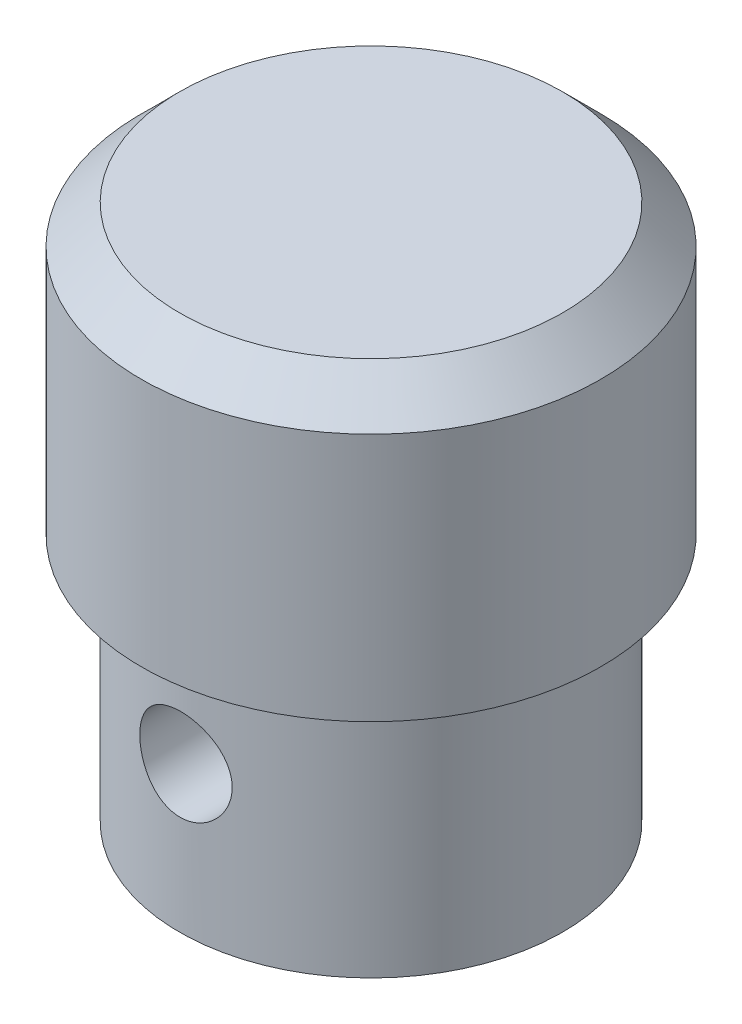
ISO-10303-21;
HEADER;
FILE_DESCRIPTION(('STEP AP214'),'2;1');
FILE_NAME('part.step','',(''),(''),'','','');
FILE_SCHEMA(('AUTOMOTIVE_DESIGN { 1 0 10303 214 1 1 1 1 }'));
ENDSEC;
DATA;
#1=APPLICATION_CONTEXT('core data for automotive mechanical design processes');
#2=APPLICATION_PROTOCOL_DEFINITION('international standard','automotive_design',2000,#1);
#3=PRODUCT_CONTEXT('',#1,'mechanical');
#4=PRODUCT('Part','Part','',(#3));
#5=PRODUCT_RELATED_PRODUCT_CATEGORY('part','',(#4));
#6=PRODUCT_DEFINITION_FORMATION('','',#4);
#7=PRODUCT_DEFINITION_CONTEXT('part definition',#1,'design');
#8=PRODUCT_DEFINITION('design','',#6,#7);
#9=PRODUCT_DEFINITION_SHAPE('','',#8);
#10=(LENGTH_UNIT() NAMED_UNIT(*) SI_UNIT(.MILLI.,.METRE.));
#11=(NAMED_UNIT(*) PLANE_ANGLE_UNIT() SI_UNIT($,.RADIAN.));
#12=(NAMED_UNIT(*) SI_UNIT($,.STERADIAN.) SOLID_ANGLE_UNIT());
#13=UNCERTAINTY_MEASURE_WITH_UNIT(LENGTH_MEASURE(1.E-05),#10,'distance_accuracy_value','');
#14=(GEOMETRIC_REPRESENTATION_CONTEXT(3) GLOBAL_UNCERTAINTY_ASSIGNED_CONTEXT((#13)) GLOBAL_UNIT_ASSIGNED_CONTEXT((#10,
#11,#12)) REPRESENTATION_CONTEXT('',''));
#15=CARTESIAN_POINT('',(0.,0.,0.));
#16=DIRECTION('',(0.,0.,1.));
#17=DIRECTION('',(1.,0.,0.));
#18=AXIS2_PLACEMENT_3D('',#15,#16,#17);
#19=CARTESIAN_POINT('',(0.,14.,0.));
#20=DIRECTION('',(0.,-1.,0.));
#21=DIRECTION('',(0.,0.,-1.));
#22=AXIS2_PLACEMENT_3D('',#19,#20,#21);
#23=PLANE('',#22);
#24=CARTESIAN_POINT('',(0.,14.,0.));
#25=DIRECTION('',(0.,-1.,0.));
#26=DIRECTION('',(0.,0.,-1.));
#27=AXIS2_PLACEMENT_3D('',#24,#25,#26);
#28=CIRCLE('',#27,4.99999999999999);
#29=CARTESIAN_POINT('',(0.,14.,-4.99999999999999));
#30=VERTEX_POINT('',#29);
#31=EDGE_CURVE('E10',#30,#30,#28,.F.);
#32=ORIENTED_EDGE('',*,*,#31,.T.);
#33=EDGE_LOOP('',(#32));
#34=FACE_BOUND('',#33,.T.);
#35=ADVANCED_FACE('F32',(#34),#23,.F.);
#36=CARTESIAN_POINT('',(0.,0.,0.));
#37=DIRECTION('',(0.,-1.,0.));
#38=DIRECTION('',(0.,0.,-1.));
#39=AXIS2_PLACEMENT_3D('',#36,#37,#38);
#40=CYLINDRICAL_SURFACE('',#39,6.);
#41=CARTESIAN_POINT('',(0.,13.,0.));
#42=DIRECTION('',(0.,-1.,0.));
#43=DIRECTION('',(0.,0.,-1.));
#44=AXIS2_PLACEMENT_3D('',#41,#42,#43);
#45=CIRCLE('',#44,6.);
#46=CARTESIAN_POINT('',(0.,13.,-6.));
#47=VERTEX_POINT('',#46);
#48=EDGE_CURVE('E39',#47,#47,#45,.T.);
#49=ORIENTED_EDGE('',*,*,#48,.T.);
#50=EDGE_LOOP('',(#49));
#51=FACE_BOUND('',#50,.T.);
#52=CARTESIAN_POINT('',(0.,6.5,0.));
#53=DIRECTION('',(0.,-1.,0.));
#54=DIRECTION('',(0.,0.,-1.));
#55=AXIS2_PLACEMENT_3D('',#52,#53,#54);
#56=CIRCLE('',#55,6.);
#57=CARTESIAN_POINT('',(0.,6.5,-6.));
#58=VERTEX_POINT('',#57);
#59=EDGE_CURVE('E43',#58,#58,#56,.T.);
#60=ORIENTED_EDGE('',*,*,#59,.F.);
#61=EDGE_LOOP('',(#60));
#62=FACE_BOUND('',#61,.T.);
#63=ADVANCED_FACE('F103',(#51,#62),#40,.T.);
#64=CARTESIAN_POINT('',(-6.,6.5,0.));
#65=DIRECTION('',(0.,1.,0.));
#66=DIRECTION('',(0.,0.,1.));
#67=AXIS2_PLACEMENT_3D('',#64,#65,#66);
#68=PLANE('',#67);
#69=CARTESIAN_POINT('',(0.,6.5,0.));
#70=DIRECTION('',(0.,-1.,0.));
#71=DIRECTION('',(0.,0.,-1.));
#72=AXIS2_PLACEMENT_3D('',#69,#70,#71);
#73=CIRCLE('',#72,5.);
#74=CARTESIAN_POINT('',(0.,6.5,-5.));
#75=VERTEX_POINT('',#74);
#76=EDGE_CURVE('E47',#75,#75,#73,.T.);
#77=ORIENTED_EDGE('',*,*,#76,.F.);
#78=EDGE_LOOP('',(#77));
#79=FACE_BOUND('',#78,.T.);
#80=ORIENTED_EDGE('',*,*,#59,.T.);
#81=EDGE_LOOP('',(#80));
#82=FACE_BOUND('',#81,.T.);
#83=ADVANCED_FACE('F98',(#79,#82),#68,.F.);
#84=CARTESIAN_POINT('',(0.,0.,0.));
#85=DIRECTION('',(0.,-1.,0.));
#86=DIRECTION('',(0.,0.,-1.));
#87=AXIS2_PLACEMENT_3D('',#84,#85,#86);
#88=CYLINDRICAL_SURFACE('',#87,5.);
#89=CARTESIAN_POINT('',(1.22287208908555,3.80568373016986,4.84815262277659));
#90=CARTESIAN_POINT('',(1.22287006583555,3.73932920459334,4.84815394087556));
#91=CARTESIAN_POINT('',(1.21735624205766,3.67295160944114,4.84955413634348));
#92=CARTESIAN_POINT('',(1.19547752524757,3.54209638908176,4.85499290129159));
#93=CARTESIAN_POINT('',(1.17910581149513,3.4776199847746,4.85903312916649));
#94=CARTESIAN_POINT('',(1.13606506639068,3.35247881200876,4.86927524462194));
#95=CARTESIAN_POINT('',(1.10940865842604,3.29180947649228,4.87547448134039));
#96=CARTESIAN_POINT('',(1.04659054655037,3.17580391270697,4.88934335764689));
#97=CARTESIAN_POINT('',(1.01042863548407,3.12046780070204,4.89701302927943));
#98=CARTESIAN_POINT('',(0.928839630548543,3.01557620419379,4.9131469588853));
#99=CARTESIAN_POINT('',(0.883255265986953,2.96614486777405,4.92162317816742));
#100=CARTESIAN_POINT('',(0.784450716612869,2.87555757239619,4.93833406089094));
#101=CARTESIAN_POINT('',(0.731229860533851,2.83440234169282,4.94656870302039));
#102=CARTESIAN_POINT('',(0.617815962838571,2.76103315708746,4.96201725878949));
#103=CARTESIAN_POINT('',(0.557542438294375,2.72894032075015,4.96921676701564));
#104=CARTESIAN_POINT('',(0.432254314817423,2.67539311524273,4.98167778524161));
#105=CARTESIAN_POINT('',(0.36724036040843,2.65393730291173,4.9869395581156));
#106=CARTESIAN_POINT('',(0.235607745307532,2.62266846841527,4.99487269081749));
#107=CARTESIAN_POINT('',(0.169041970595982,2.61264484448658,4.997590736273));
#108=CARTESIAN_POINT('',(0.0351205920264556,2.60386472229321,5.00032492894212));
#109=CARTESIAN_POINT('',(-0.0322349026036537,2.6051066838002,5.00034144550226));
#110=CARTESIAN_POINT('',(-0.164365788067145,2.61866921048386,4.99772586244975));
#111=CARTESIAN_POINT('',(-0.229165771657675,2.63076256383729,4.99514795224698));
#112=CARTESIAN_POINT('',(-0.355799341301257,2.66532042535501,4.98772817727533));
#113=CARTESIAN_POINT('',(-0.417632776531861,2.687785460211,4.98288619753297));
#114=CARTESIAN_POINT('',(-0.53718565942039,2.74263846326898,4.97142553527715));
#115=CARTESIAN_POINT('',(-0.594865736118368,2.77510903247723,4.96479212208119));
#116=CARTESIAN_POINT('',(-0.70404431574013,2.84898910363638,4.95049066155505));
#117=CARTESIAN_POINT('',(-0.7555418173762,2.89040005047918,4.94282244706148));
#118=CARTESIAN_POINT('',(-0.852245535431726,2.98220989060371,4.92708238933714));
#119=CARTESIAN_POINT('',(-0.897262442767846,3.03280747663746,4.91900524838703));
#120=CARTESIAN_POINT('',(-0.978209400081669,3.14091398463322,4.90355070048026));
#121=CARTESIAN_POINT('',(-1.01413909077264,3.19842317973109,4.89617332119771));
#122=CARTESIAN_POINT('',(-1.07599732416585,3.31906983267514,4.88295393151402));
#123=CARTESIAN_POINT('',(-1.10188355681892,3.38222975060055,4.87711844886019));
#124=CARTESIAN_POINT('',(-1.1426031452849,3.51217697956046,4.86774068071768));
#125=CARTESIAN_POINT('',(-1.15743865787058,3.57896358004268,4.86419794776998));
#126=CARTESIAN_POINT('',(-1.17532655016371,3.71252108219415,4.85990645817701));
#127=CARTESIAN_POINT('',(-1.17865776152943,3.77925255916924,4.8590916008127));
#128=CARTESIAN_POINT('',(-1.17420270742544,3.91231700779659,4.86017008065787));
#129=CARTESIAN_POINT('',(-1.16641737693592,3.978650012492,4.86206319010812));
#130=CARTESIAN_POINT('',(-1.14019469566293,4.10802209707681,4.86827806268898));
#131=CARTESIAN_POINT('',(-1.12191672515406,4.17109540053732,4.87256346135319));
#132=CARTESIAN_POINT('',(-1.07540463131612,4.29328685843599,4.88303897319912));
#133=CARTESIAN_POINT('',(-1.04716940124567,4.35240457234419,4.88922929810211));
#134=CARTESIAN_POINT('',(-0.980953031392155,4.46619523105163,4.90294715131229));
#135=CARTESIAN_POINT('',(-0.942803579205754,4.52076747977232,4.91049700315495));
#136=CARTESIAN_POINT('',(-0.858060153664142,4.62284402372737,4.92601100606877));
#137=CARTESIAN_POINT('',(-0.811464906184145,4.67034725056402,4.93397521952072));
#138=CARTESIAN_POINT('',(-0.70988241681241,4.75804973401357,4.94962247748756));
#139=CARTESIAN_POINT('',(-0.654727706727816,4.79805723256572,4.95729493492275));
#140=CARTESIAN_POINT('',(-0.538325996949068,4.86824711540386,4.97128113930499));
#141=CARTESIAN_POINT('',(-0.477079307162056,4.89842999914772,4.9775949553163));
#142=CARTESIAN_POINT('',(-0.350648086903743,4.94786272107986,4.98808954793988));
#143=CARTESIAN_POINT('',(-0.285494600719052,4.9671886583785,4.9922851500755));
#144=CARTESIAN_POINT('',(-0.152755189338317,4.9945908583286,4.99810709065374));
#145=CARTESIAN_POINT('',(-0.0851696966607522,5.00266911127205,4.99973388365722));
#146=CARTESIAN_POINT('',(0.0487068563890548,5.00724207728466,5.00019977739251));
#147=CARTESIAN_POINT('',(0.114988129256587,5.00402083254647,4.99910743327699));
#148=CARTESIAN_POINT('',(0.246023283835571,4.98673174496285,4.99437398011174));
#149=CARTESIAN_POINT('',(0.310777204578665,4.97266417960645,4.99073293626739));
#150=CARTESIAN_POINT('',(0.436649239032453,4.93422900012349,4.98129563169815));
#151=CARTESIAN_POINT('',(0.497782718484563,4.90990910239323,4.97550937009542));
#152=CARTESIAN_POINT('',(0.615127502050268,4.85170363251071,4.9623692185692));
#153=CARTESIAN_POINT('',(0.671338229001315,4.81781694067244,4.95501514517558));
#154=CARTESIAN_POINT('',(0.778603752362159,4.74055354045796,4.93930998795572));
#155=CARTESIAN_POINT('',(0.829515277978628,4.69698170186817,4.93094029819968));
#156=CARTESIAN_POINT('',(0.923400092433845,4.60196868593821,4.91422540415598));
#157=CARTESIAN_POINT('',(0.966371403582468,4.55052555389119,4.90588020647663));
#158=CARTESIAN_POINT('',(1.04386526885574,4.44018797249167,4.88998367059981));
#159=CARTESIAN_POINT('',(1.07823344711275,4.38118268191064,4.88244805809739));
#160=CARTESIAN_POINT('',(1.13651870523811,4.25805899151066,4.86921195035363));
#161=CARTESIAN_POINT('',(1.16044381230729,4.19394456388616,4.86351004649917));
#162=CARTESIAN_POINT('',(1.19336425730693,4.07584658877398,4.85552303429849));
#163=CARTESIAN_POINT('',(1.20440664265636,4.02245539888801,4.85277881444296));
#164=CARTESIAN_POINT('',(1.21916112700566,3.9146091805389,4.84909313209798));
#165=CARTESIAN_POINT('',(1.22287374997356,3.86015422839988,4.8481515407478));
#166=CARTESIAN_POINT('',(1.22287208908555,3.80568373016986,4.84815262277659));
#167=B_SPLINE_CURVE_WITH_KNOTS('',3,(#89,#90,#91,#92,#93,#94,#95,#96,#97,#98,#99,#100,#101,#102,
#103,#104,#105,#106,#107,#108,#109,#110,#111,#112,#113,#114,#115,#116,#117,#118,#119,#120,#121,
#122,#123,#124,#125,#126,#127,#128,#129,#130,#131,#132,#133,#134,#135,#136,#137,#138,#139,#140,
#141,#142,#143,#144,#145,#146,#147,#148,#149,#150,#151,#152,#153,#154,#155,#156,#157,#158,#159,
#160,#161,#162,#163,#164,#165,#166),.UNSPECIFIED.,.T.,.F.,(4,2,2,2,2,2,2,2,2,2,2,2,2,2,2,2,2,2,
2,2,2,2,2,2,2,2,2,2,2,2,2,2,2,2,2,2,2,2,4),(0.,0.198863684875772,0.397852410615558,
0.596597671501015,0.79534726403944,0.997729672776177,1.20012988233893,1.4051193230652,
1.61008094456724,1.81120251394426,2.01229658643973,2.20927584611688,2.40626510983778,
2.60492628768564,2.80361959606554,3.00727667386882,3.21094180252579,3.41545582890606,
3.61992992974889,3.81941198396487,4.01887726131021,4.21538999294228,4.41192457369417,
4.61204261040559,4.81219086190154,5.01691376492012,5.22162625873251,5.42488537167318,
5.62810851308333,5.82626011732856,6.02440665229053,6.22164098170177,6.41889840475698,
6.62056343082036,6.82227861861515,7.02738891173638,7.23234126535597,7.39560033961481,
7.55884774287669),.UNSPECIFIED.);
#168=CARTESIAN_POINT('',(1.22287208908555,3.80568373016986,4.84815262277659));
#169=VERTEX_POINT('',#168);
#170=EDGE_CURVE('E59',#169,#169,#167,.T.);
#171=ORIENTED_EDGE('',*,*,#170,.T.);
#172=EDGE_LOOP('',(#171));
#173=FACE_BOUND('',#172,.T.);
#174=CARTESIAN_POINT('',(0.,0.,0.));
#175=DIRECTION('',(0.,-1.,0.));
#176=DIRECTION('',(0.,0.,-1.));
#177=AXIS2_PLACEMENT_3D('',#174,#175,#176);
#178=CIRCLE('',#177,5.);
#179=CARTESIAN_POINT('',(0.,0.,-5.));
#180=VERTEX_POINT('',#179);
#181=EDGE_CURVE('E52',#180,#180,#178,.T.);
#182=ORIENTED_EDGE('',*,*,#181,.F.);
#183=EDGE_LOOP('',(#182));
#184=FACE_BOUND('',#183,.T.);
#185=ORIENTED_EDGE('',*,*,#76,.T.);
#186=EDGE_LOOP('',(#185));
#187=FACE_BOUND('',#186,.T.);
#188=ADVANCED_FACE('F72',(#173,#184,#187),#88,.T.);
#189=CARTESIAN_POINT('',(-5.,0.,0.));
#190=DIRECTION('',(0.,1.,0.));
#191=DIRECTION('',(0.,0.,1.));
#192=AXIS2_PLACEMENT_3D('',#189,#190,#191);
#193=PLANE('',#192);
#194=CARTESIAN_POINT('',(0.,0.,0.));
#195=DIRECTION('',(0.,-1.,0.));
#196=DIRECTION('',(0.,0.,-1.));
#197=AXIS2_PLACEMENT_3D('',#194,#195,#196);
#198=CIRCLE('',#197,1.5);
#199=CARTESIAN_POINT('',(0.,0.,-1.5));
#200=VERTEX_POINT('',#199);
#201=EDGE_CURVE('E56',#200,#200,#198,.T.);
#202=ORIENTED_EDGE('',*,*,#201,.F.);
#203=EDGE_LOOP('',(#202));
#204=FACE_BOUND('',#203,.T.);
#205=ORIENTED_EDGE('',*,*,#181,.T.);
#206=EDGE_LOOP('',(#205));
#207=FACE_BOUND('',#206,.T.);
#208=ADVANCED_FACE('F90',(#204,#207),#193,.F.);
#209=CARTESIAN_POINT('',(0.,13.,0.));
#210=DIRECTION('',(0.,-1.,0.));
#211=DIRECTION('',(0.,0.,-1.));
#212=AXIS2_PLACEMENT_3D('',#209,#210,#211);
#213=CONICAL_SURFACE('',#212,6.,0.785398163397449);
#214=ORIENTED_EDGE('',*,*,#31,.F.);
#215=EDGE_LOOP('',(#214));
#216=FACE_BOUND('',#215,.T.);
#217=ORIENTED_EDGE('',*,*,#48,.F.);
#218=EDGE_LOOP('',(#217));
#219=FACE_BOUND('',#218,.T.);
#220=ADVANCED_FACE('F34',(#216,#219),#213,.T.);
#221=CARTESIAN_POINT('',(0.,10.,0.));
#222=DIRECTION('',(0.,-1.,0.));
#223=DIRECTION('',(0.,0.,-1.));
#224=AXIS2_PLACEMENT_3D('',#221,#222,#223);
#225=CYLINDRICAL_SURFACE('',#224,1.5);
#226=CARTESIAN_POINT('',(1.20423006103565,3.80568373016986,0.894332130753493));
#227=CARTESIAN_POINT('',(1.20422409931287,3.85073234060299,0.894345813573896));
#228=CARTESIAN_POINT('',(1.20167983066978,3.89585108582603,0.897797725380765));
#229=CARTESIAN_POINT('',(1.19173437620972,3.98467244782763,0.910950013808097));
#230=CARTESIAN_POINT('',(1.1843165240581,4.02836966325714,0.92067182969666));
#231=CARTESIAN_POINT('',(1.1618170887931,4.12824698187499,0.949002593424484));
#232=CARTESIAN_POINT('',(1.14496546994049,4.18346923442959,0.969528089132049));
#233=CARTESIAN_POINT('',(1.10451811398975,4.28926461426663,1.01537080485693));
#234=CARTESIAN_POINT('',(1.08090336934401,4.33982409997014,1.04070146090854));
#235=CARTESIAN_POINT('',(1.01787819998889,4.45388752423816,1.10296287782676));
#236=CARTESIAN_POINT('',(0.975843663845468,4.51546367464623,1.14077681499808));
#237=CARTESIAN_POINT('',(0.880912763561575,4.63006983129719,1.21558808689791));
#238=CARTESIAN_POINT('',(0.828025452781937,4.68310689543819,1.25258607398295));
#239=CARTESIAN_POINT('',(0.72306592020744,4.76994668191634,1.31534949182968));
#240=CARTESIAN_POINT('',(0.672894599056176,4.8054794997803,1.34189037735715));
#241=CARTESIAN_POINT('',(0.566028430915812,4.86910330614963,1.39033760828187));
#242=CARTESIAN_POINT('',(0.509343920682423,4.89720585909038,1.41225114483442));
#243=CARTESIAN_POINT('',(0.40001536534151,4.94071150651825,1.44662391996389));
#244=CARTESIAN_POINT('',(0.348199941754671,4.95743326891552,1.46003892136321));
#245=CARTESIAN_POINT('',(0.241700117320935,4.98378294732225,1.48139235061677));
#246=CARTESIAN_POINT('',(0.187017303067042,4.99341474291588,1.48933377342629));
#247=CARTESIAN_POINT('',(0.0760979623346311,5.00499858614393,1.49910568271024));
#248=CARTESIAN_POINT('',(0.0198567297188965,5.00692404578304,1.50091500926578));
#249=CARTESIAN_POINT('',(-0.0921869383878117,5.00288518924654,1.49821292081499));
#250=CARTESIAN_POINT('',(-0.147989353451961,4.99692050794873,1.49370121329747));
#251=CARTESIAN_POINT('',(-0.254438771498005,4.97804293838202,1.47918628596642));
#252=CARTESIAN_POINT('',(-0.30520099780201,4.96552643999621,1.4694957513292));
#253=CARTESIAN_POINT('',(-0.403692015043924,4.93446658961851,1.44554639206551));
#254=CARTESIAN_POINT('',(-0.451420036918443,4.91592171687131,1.43128641473586));
#255=CARTESIAN_POINT('',(-0.54753335284908,4.87152331101674,1.39751442399983));
#256=CARTESIAN_POINT('',(-0.595539069718251,4.84513782056103,1.37762880652794));
#257=CARTESIAN_POINT('',(-0.686540413920465,4.78696101441483,1.33461605749918));
#258=CARTESIAN_POINT('',(-0.729533213781453,4.755166672552,1.31148711262845));
#259=CARTESIAN_POINT('',(-0.818635979684102,4.67984660889054,1.25819482786811));
#260=CARTESIAN_POINT('',(-0.863562423745024,4.63525356164693,1.2275641104165));
#261=CARTESIAN_POINT('',(-0.945745967538966,4.5399301879794,1.16542630776325));
#262=CARTESIAN_POINT('',(-0.982993595433885,4.48919240296529,1.13391819400057));
#263=CARTESIAN_POINT('',(-1.04631149982412,4.38695161267909,1.07559310268103));
#264=CARTESIAN_POINT('',(-1.07311286189884,4.33599316586163,1.04861660981831));
#265=CARTESIAN_POINT('',(-1.11963793827041,4.22906385036914,0.998782703748472));
#266=CARTESIAN_POINT('',(-1.13937712331794,4.17310427796727,0.975916342093358));
#267=CARTESIAN_POINT('',(-1.16593591388406,4.0740087677532,0.943870579383091));
#268=CARTESIAN_POINT('',(-1.1748575122877,4.03211603163111,0.932643299800397));
#269=CARTESIAN_POINT('',(-1.18817804798358,3.94657560659736,0.915616131728873));
#270=CARTESIAN_POINT('',(-1.19258706860071,3.90293205782346,0.909804145421885));
#271=CARTESIAN_POINT('',(-1.19652809219927,3.81476570341343,0.90461829268651));
#272=CARTESIAN_POINT('',(-1.19603182963449,3.77023927913539,0.905281739148379));
#273=CARTESIAN_POINT('',(-1.19014417724938,3.68205533514741,0.913004281804997));
#274=CARTESIAN_POINT('',(-1.1847458802757,3.63839913033738,0.920072402399777));
#275=CARTESIAN_POINT('',(-1.1675609635522,3.54224580857276,0.941824438291834));
#276=CARTESIAN_POINT('',(-1.15449858217352,3.49032476929135,0.95798830862297));
#277=CARTESIAN_POINT('',(-1.12236741900293,3.39030921051857,0.995439757186718));
#278=CARTESIAN_POINT('',(-1.1032807301962,3.34222664162799,1.01674256562599));
#279=CARTESIAN_POINT('',(-1.04980116535058,3.22876637256028,1.0723811145662));
#280=CARTESIAN_POINT('',(-1.01240118988475,3.16554652957476,1.10821906233605));
#281=CARTESIAN_POINT('',(-0.927072403128298,3.04705324062465,1.18054528343974));
#282=CARTESIAN_POINT('',(-0.879131200640739,2.99178927435978,1.21703427529979));
#283=CARTESIAN_POINT('',(-0.772151448036284,2.88920604576284,1.28761471518694));
#284=CARTESIAN_POINT('',(-0.712965585517153,2.84201015270202,1.32166497294986));
#285=CARTESIAN_POINT('',(-0.58446670301072,2.75852381370335,1.38326934802904));
#286=CARTESIAN_POINT('',(-0.515187674692895,2.72219796676748,1.41084448857823));
#287=CARTESIAN_POINT('',(-0.391892420857052,2.67258937768973,1.44884280413982));
#288=CARTESIAN_POINT('',(-0.34015590572442,2.6556533039854,1.46192957586262));
#289=CARTESIAN_POINT('',(-0.233831307252749,2.62882444919148,1.48264827062895));
#290=CARTESIAN_POINT('',(-0.179245434993121,2.61892629144549,1.49028435777177));
#291=CARTESIAN_POINT('',(-0.0685077532125938,2.60676803570705,1.49946787153305));
#292=CARTESIAN_POINT('',(-0.0123509766648152,2.60453580713488,1.50099308546445));
#293=CARTESIAN_POINT('',(0.0995404780894688,2.607943635729,1.49773964534848));
#294=CARTESIAN_POINT('',(0.15527512629649,2.61358424721484,1.49296054742151));
#295=CARTESIAN_POINT('',(0.261662157609104,2.6318458584246,1.47792677003257));
#296=CARTESIAN_POINT('',(0.312426923121625,2.64407732901157,1.46797866067954));
#297=CARTESIAN_POINT('',(0.410922879939619,2.67459578295795,1.44350980123998));
#298=CARTESIAN_POINT('',(0.458653281743995,2.69288433466548,1.42898786690969));
#299=CARTESIAN_POINT('',(0.554612257882336,2.73670845680541,1.39471778704925));
#300=CARTESIAN_POINT('',(0.602473877275869,2.76276003543647,1.37460906413159));
#301=CARTESIAN_POINT('',(0.693202384194196,2.82026913242665,1.33116680055983));
#302=CARTESIAN_POINT('',(0.736066599438473,2.85172952101097,1.30783154901802));
#303=CARTESIAN_POINT('',(0.824851575827678,2.92626145797208,1.25412597156593));
#304=CARTESIAN_POINT('',(0.869602179504807,2.97039157815912,1.22329331521236));
#305=CARTESIAN_POINT('',(0.951499428026107,3.06475388548391,1.16073456600781));
#306=CARTESIAN_POINT('',(0.98863650381813,3.11499362673308,1.12900740515295));
#307=CARTESIAN_POINT('',(1.0523628040286,3.21705825688763,1.06970486908752));
#308=CARTESIAN_POINT('',(1.07956175859314,3.26842724289952,1.0420011473062));
#309=CARTESIAN_POINT('',(1.12678159504302,3.37631886312069,0.990743062637814));
#310=CARTESIAN_POINT('',(1.14681591516575,3.43283159699251,0.967180974237523));
#311=CARTESIAN_POINT('',(1.17390138641333,3.53336732622147,0.933956179131819));
#312=CARTESIAN_POINT('',(1.18304025039447,3.57613545681418,0.922243672350935));
#313=CARTESIAN_POINT('',(1.19663580549478,3.66349829275239,0.90454088364353));
#314=CARTESIAN_POINT('',(1.2011103201516,3.70808536333664,0.898528827030233));
#315=CARTESIAN_POINT('',(1.20384693629776,3.77047885877526,0.894846703657692));
#316=CARTESIAN_POINT('',(1.20423239124694,3.78807593711594,0.894326782658008));
#317=CARTESIAN_POINT('',(1.20423006103565,3.80568373016986,0.894332130753493));
#318=B_SPLINE_CURVE_WITH_KNOTS('',3,(#226,#227,#228,#229,#230,#231,#232,#233,#234,#235,#236,
#237,#238,#239,#240,#241,#242,#243,#244,#245,#246,#247,#248,#249,#250,#251,#252,#253,#254,#255,
#256,#257,#258,#259,#260,#261,#262,#263,#264,#265,#266,#267,#268,#269,#270,#271,#272,#273,#274,
#275,#276,#277,#278,#279,#280,#281,#282,#283,#284,#285,#286,#287,#288,#289,#290,#291,#292,#293,
#294,#295,#296,#297,#298,#299,#300,#301,#302,#303,#304,#305,#306,#307,#308,#309,#310,#311,#312,
#313,#314,#315,#316,#317),.UNSPECIFIED.,.T.,.F.,(4,2,2,2,2,2,2,2,2,2,2,2,2,2,2,2,2,2,2,2,2,2,2,
2,2,2,2,2,2,2,2,2,2,2,2,2,2,2,2,2,2,2,2,2,2,4),(0.,0.135084491287974,0.27063335633701,
0.453428630796527,0.636742773569782,0.886324827670037,1.13569952122127,1.33583581907457,
1.53565876710614,1.70317256661106,1.87059463536563,2.03859383956756,2.20660081833124,
2.36545150500777,2.52434229548774,2.69853906413055,2.8728336157569,3.08304735927841,
3.29351887062639,3.48371516030979,3.6734922080222,3.805846357709,3.93790411296248,
4.07072326169671,4.20372984856053,4.37057136226315,4.53791355178446,4.78185487185398,
5.0260844923714,5.2737670496889,5.52063396155904,5.68791556567888,5.85506923634549,
6.02282995313261,6.19060248239613,6.34940065189869,6.50823997088735,6.68186015305212,
6.85557275404761,7.06484111434693,7.27437090226763,7.46697444552422,7.65921481638089,
7.79454829960207,7.92936272574332,7.98216212942132),.UNSPECIFIED.);
#319=CARTESIAN_POINT('',(1.20423006103565,3.80568373016986,0.894332130753493));
#320=VERTEX_POINT('',#319);
#321=EDGE_CURVE('E68',#320,#320,#318,.T.);
#322=ORIENTED_EDGE('',*,*,#321,.T.);
#323=EDGE_LOOP('',(#322));
#324=FACE_BOUND('',#323,.T.);
#325=CARTESIAN_POINT('',(0.,10.,0.));
#326=DIRECTION('',(0.,-1.,0.));
#327=DIRECTION('',(0.,0.,-1.));
#328=AXIS2_PLACEMENT_3D('',#325,#326,#327);
#329=CIRCLE('',#328,1.5);
#330=CARTESIAN_POINT('',(0.,10.,-1.5));
#331=VERTEX_POINT('',#330);
#332=EDGE_CURVE('E55',#331,#331,#329,.T.);
#333=ORIENTED_EDGE('',*,*,#332,.F.);
#334=EDGE_LOOP('',(#333));
#335=FACE_BOUND('',#334,.T.);
#336=ORIENTED_EDGE('',*,*,#201,.T.);
#337=EDGE_LOOP('',(#336));
#338=FACE_BOUND('',#337,.T.);
#339=ADVANCED_FACE('F86',(#324,#335,#338),#225,.F.);
#340=CARTESIAN_POINT('',(0.,10.,0.));
#341=DIRECTION('',(0.,-1.,0.));
#342=DIRECTION('',(0.,0.,-1.));
#343=AXIS2_PLACEMENT_3D('',#340,#341,#342);
#344=PLANE('',#343);
#345=ORIENTED_EDGE('',*,*,#332,.T.);
#346=EDGE_LOOP('',(#345));
#347=FACE_BOUND('',#346,.T.);
#348=ADVANCED_FACE('F79',(#347),#344,.T.);
#349=CARTESIAN_POINT('',(0.0235744400620217,3.80568373016986,4.99994442426871));
#350=DIRECTION('',(0.0047148880124045,0.,0.999988884853742));
#351=DIRECTION('',(0.999988884853742,0.,-0.0047148880124045));
#352=AXIS2_PLACEMENT_3D('',#349,#350,#351);
#353=CYLINDRICAL_SURFACE('',#352,1.19999999999999);
#354=ORIENTED_EDGE('',*,*,#321,.F.);
#355=EDGE_LOOP('',(#354));
#356=FACE_BOUND('',#355,.T.);
#357=ORIENTED_EDGE('',*,*,#170,.F.);
#358=EDGE_LOOP('',(#357));
#359=FACE_BOUND('',#358,.T.);
#360=ADVANCED_FACE('F76',(#356,#359),#353,.F.);
#361=CLOSED_SHELL('',(#35,#63,#83,#188,#208,#220,#339,#348,#360));
#362=MANIFOLD_SOLID_BREP('B2',#361);
#363=ADVANCED_BREP_SHAPE_REPRESENTATION('',(#18,#362),#14);
#364=SHAPE_DEFINITION_REPRESENTATION(#9,#363);
ENDSEC;
END-ISO-10303-21;
